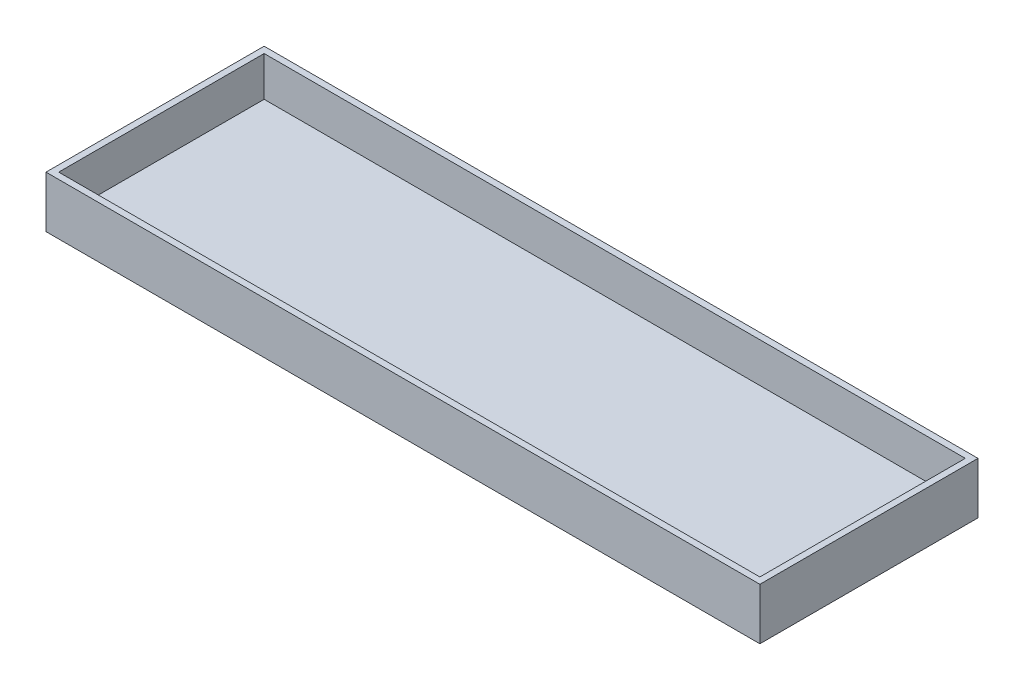
ISO-10303-21;
HEADER;
FILE_DESCRIPTION(('STEP AP214'),'2;1');
FILE_NAME('part.step','',(''),(''),'','','');
FILE_SCHEMA(('AUTOMOTIVE_DESIGN { 1 0 10303 214 1 1 1 1 }'));
ENDSEC;
DATA;
#1=APPLICATION_CONTEXT('core data for automotive mechanical design processes');
#2=APPLICATION_PROTOCOL_DEFINITION('international standard','automotive_design',2000,#1);
#3=PRODUCT_CONTEXT('',#1,'mechanical');
#4=PRODUCT('Part','Part','',(#3));
#5=PRODUCT_RELATED_PRODUCT_CATEGORY('part','',(#4));
#6=PRODUCT_DEFINITION_FORMATION('','',#4);
#7=PRODUCT_DEFINITION_CONTEXT('part definition',#1,'design');
#8=PRODUCT_DEFINITION('design','',#6,#7);
#9=PRODUCT_DEFINITION_SHAPE('','',#8);
#10=(LENGTH_UNIT() NAMED_UNIT(*) SI_UNIT(.MILLI.,.METRE.));
#11=(NAMED_UNIT(*) PLANE_ANGLE_UNIT() SI_UNIT($,.RADIAN.));
#12=(NAMED_UNIT(*) SI_UNIT($,.STERADIAN.) SOLID_ANGLE_UNIT());
#13=UNCERTAINTY_MEASURE_WITH_UNIT(LENGTH_MEASURE(1.E-05),#10,'distance_accuracy_value','');
#14=(GEOMETRIC_REPRESENTATION_CONTEXT(3) GLOBAL_UNCERTAINTY_ASSIGNED_CONTEXT((#13)) GLOBAL_UNIT_ASSIGNED_CONTEXT((#10,
#11,#12)) REPRESENTATION_CONTEXT('',''));
#15=CARTESIAN_POINT('',(0.,0.,0.));
#16=DIRECTION('',(0.,0.,1.));
#17=DIRECTION('',(1.,0.,0.));
#18=AXIS2_PLACEMENT_3D('',#15,#16,#17);
#19=CARTESIAN_POINT('',(90.,3.,-27.5));
#20=DIRECTION('',(-1.,0.,0.));
#21=DIRECTION('',(0.,0.,1.));
#22=AXIS2_PLACEMENT_3D('',#19,#20,#21);
#23=PLANE('',#22);
#24=DIRECTION('',(0.,0.,-1.));
#25=VECTOR('',#24,1.);
#26=CARTESIAN_POINT('',(90.,0.,-27.5));
#27=LINE('',#26,#25);
#28=CARTESIAN_POINT('',(90.,0.,27.5));
#29=VERTEX_POINT('',#28);
#30=CARTESIAN_POINT('',(90.,0.,-27.5));
#31=VERTEX_POINT('',#30);
#32=EDGE_CURVE('E144',#29,#31,#27,.T.);
#33=ORIENTED_EDGE('',*,*,#32,.T.);
#34=DIRECTION('',(0.,-1.,0.));
#35=VECTOR('',#34,1.);
#36=CARTESIAN_POINT('',(90.,3.,-27.5));
#37=LINE('',#36,#35);
#38=CARTESIAN_POINT('',(90.,13.,-27.5));
#39=VERTEX_POINT('',#38);
#40=EDGE_CURVE('E11',#39,#31,#37,.T.);
#41=ORIENTED_EDGE('',*,*,#40,.F.);
#42=DIRECTION('',(0.,0.,-1.));
#43=VECTOR('',#42,1.);
#44=CARTESIAN_POINT('',(90.,13.,27.5));
#45=LINE('',#44,#43);
#46=CARTESIAN_POINT('',(90.,13.,27.5));
#47=VERTEX_POINT('',#46);
#48=EDGE_CURVE('E135',#47,#39,#45,.T.);
#49=ORIENTED_EDGE('',*,*,#48,.F.);
#50=DIRECTION('',(0.,-1.,0.));
#51=VECTOR('',#50,1.);
#52=CARTESIAN_POINT('',(90.,3.,27.5));
#53=LINE('',#52,#51);
#54=EDGE_CURVE('E153',#47,#29,#53,.T.);
#55=ORIENTED_EDGE('',*,*,#54,.T.);
#56=EDGE_LOOP('',(#33,#41,#49,#55));
#57=FACE_BOUND('',#56,.T.);
#58=ADVANCED_FACE('F33',(#57),#23,.F.);
#59=CARTESIAN_POINT('',(-90.,3.,-27.5));
#60=DIRECTION('',(0.,0.,1.));
#61=DIRECTION('',(1.,0.,0.));
#62=AXIS2_PLACEMENT_3D('',#59,#60,#61);
#63=PLANE('',#62);
#64=DIRECTION('',(-1.,0.,0.));
#65=VECTOR('',#64,1.);
#66=CARTESIAN_POINT('',(-90.,0.,-27.5));
#67=LINE('',#66,#65);
#68=CARTESIAN_POINT('',(-90.,0.,-27.5));
#69=VERTEX_POINT('',#68);
#70=EDGE_CURVE('E147',#31,#69,#67,.T.);
#71=ORIENTED_EDGE('',*,*,#70,.T.);
#72=DIRECTION('',(0.,-1.,0.));
#73=VECTOR('',#72,1.);
#74=CARTESIAN_POINT('',(-90.,3.,-27.5));
#75=LINE('',#74,#73);
#76=CARTESIAN_POINT('',(-90.,13.,-27.5));
#77=VERTEX_POINT('',#76);
#78=EDGE_CURVE('E40',#77,#69,#75,.T.);
#79=ORIENTED_EDGE('',*,*,#78,.F.);
#80=DIRECTION('',(-1.,0.,0.));
#81=VECTOR('',#80,1.);
#82=CARTESIAN_POINT('',(90.,13.,-27.5));
#83=LINE('',#82,#81);
#84=EDGE_CURVE('E138',#39,#77,#83,.T.);
#85=ORIENTED_EDGE('',*,*,#84,.F.);
#86=ORIENTED_EDGE('',*,*,#40,.T.);
#87=EDGE_LOOP('',(#71,#79,#85,#86));
#88=FACE_BOUND('',#87,.T.);
#89=ADVANCED_FACE('F175',(#88),#63,.F.);
#90=CARTESIAN_POINT('',(-90.,3.,-27.5));
#91=DIRECTION('',(1.,0.,0.));
#92=DIRECTION('',(0.,0.,-1.));
#93=AXIS2_PLACEMENT_3D('',#90,#91,#92);
#94=PLANE('',#93);
#95=DIRECTION('',(0.,0.,1.));
#96=VECTOR('',#95,1.);
#97=CARTESIAN_POINT('',(-90.,0.,-27.5));
#98=LINE('',#97,#96);
#99=CARTESIAN_POINT('',(-90.,0.,27.5));
#100=VERTEX_POINT('',#99);
#101=EDGE_CURVE('E149',#69,#100,#98,.T.);
#102=ORIENTED_EDGE('',*,*,#101,.T.);
#103=DIRECTION('',(0.,-1.,0.));
#104=VECTOR('',#103,1.);
#105=CARTESIAN_POINT('',(-90.,3.,27.5));
#106=LINE('',#105,#104);
#107=CARTESIAN_POINT('',(-90.,13.,27.5));
#108=VERTEX_POINT('',#107);
#109=EDGE_CURVE('E156',#108,#100,#106,.T.);
#110=ORIENTED_EDGE('',*,*,#109,.F.);
#111=DIRECTION('',(0.,0.,1.));
#112=VECTOR('',#111,1.);
#113=CARTESIAN_POINT('',(-90.,13.,-27.5));
#114=LINE('',#113,#112);
#115=EDGE_CURVE('E141',#77,#108,#114,.T.);
#116=ORIENTED_EDGE('',*,*,#115,.F.);
#117=ORIENTED_EDGE('',*,*,#78,.T.);
#118=EDGE_LOOP('',(#102,#110,#116,#117));
#119=FACE_BOUND('',#118,.T.);
#120=ADVANCED_FACE('F162',(#119),#94,.F.);
#121=CARTESIAN_POINT('',(-90.,3.,27.5));
#122=DIRECTION('',(0.,0.,-1.));
#123=DIRECTION('',(-1.,0.,0.));
#124=AXIS2_PLACEMENT_3D('',#121,#122,#123);
#125=PLANE('',#124);
#126=DIRECTION('',(1.,0.,0.));
#127=VECTOR('',#126,1.);
#128=CARTESIAN_POINT('',(-90.,0.,27.5));
#129=LINE('',#128,#127);
#130=EDGE_CURVE('E151',#100,#29,#129,.T.);
#131=ORIENTED_EDGE('',*,*,#130,.T.);
#132=ORIENTED_EDGE('',*,*,#54,.F.);
#133=DIRECTION('',(1.,0.,0.));
#134=VECTOR('',#133,1.);
#135=CARTESIAN_POINT('',(-90.,13.,27.5));
#136=LINE('',#135,#134);
#137=EDGE_CURVE('E111',#108,#47,#136,.T.);
#138=ORIENTED_EDGE('',*,*,#137,.F.);
#139=ORIENTED_EDGE('',*,*,#109,.T.);
#140=EDGE_LOOP('',(#131,#132,#138,#139));
#141=FACE_BOUND('',#140,.T.);
#142=ADVANCED_FACE('F170',(#141),#125,.F.);
#143=CARTESIAN_POINT('',(0.,0.,0.));
#144=DIRECTION('',(0.,1.,0.));
#145=DIRECTION('',(0.,0.,1.));
#146=AXIS2_PLACEMENT_3D('',#143,#144,#145);
#147=PLANE('',#146);
#148=ORIENTED_EDGE('',*,*,#32,.F.);
#149=ORIENTED_EDGE('',*,*,#130,.F.);
#150=ORIENTED_EDGE('',*,*,#101,.F.);
#151=ORIENTED_EDGE('',*,*,#70,.F.);
#152=EDGE_LOOP('',(#148,#149,#150,#151));
#153=FACE_BOUND('',#152,.T.);
#154=ADVANCED_FACE('F168',(#153),#147,.F.);
#155=CARTESIAN_POINT('',(0.,13.,0.));
#156=DIRECTION('',(0.,1.,0.));
#157=DIRECTION('',(0.,0.,1.));
#158=AXIS2_PLACEMENT_3D('',#155,#156,#157);
#159=PLANE('',#158);
#160=ORIENTED_EDGE('',*,*,#137,.T.);
#161=ORIENTED_EDGE('',*,*,#48,.T.);
#162=ORIENTED_EDGE('',*,*,#84,.T.);
#163=ORIENTED_EDGE('',*,*,#115,.T.);
#164=EDGE_LOOP('',(#160,#161,#162,#163));
#165=FACE_BOUND('',#164,.T.);
#166=DIRECTION('',(-1.,0.,0.));
#167=VECTOR('',#166,1.);
#168=CARTESIAN_POINT('',(-88.4,13.,-25.9));
#169=LINE('',#168,#167);
#170=CARTESIAN_POINT('',(88.4,13.,-25.9));
#171=VERTEX_POINT('',#170);
#172=CARTESIAN_POINT('',(-88.4,13.,-25.9));
#173=VERTEX_POINT('',#172);
#174=EDGE_CURVE('E105',#171,#173,#169,.T.);
#175=ORIENTED_EDGE('',*,*,#174,.F.);
#176=DIRECTION('',(0.,0.,-1.));
#177=VECTOR('',#176,1.);
#178=CARTESIAN_POINT('',(88.4,13.,-25.9));
#179=LINE('',#178,#177);
#180=CARTESIAN_POINT('',(88.4,13.,25.9));
#181=VERTEX_POINT('',#180);
#182=EDGE_CURVE('E96',#181,#171,#179,.T.);
#183=ORIENTED_EDGE('',*,*,#182,.F.);
#184=DIRECTION('',(1.,0.,0.));
#185=VECTOR('',#184,1.);
#186=CARTESIAN_POINT('',(-88.4,13.,25.9));
#187=LINE('',#186,#185);
#188=CARTESIAN_POINT('',(-88.4,13.,25.9));
#189=VERTEX_POINT('',#188);
#190=EDGE_CURVE('E119',#189,#181,#187,.T.);
#191=ORIENTED_EDGE('',*,*,#190,.F.);
#192=DIRECTION('',(0.,0.,1.));
#193=VECTOR('',#192,1.);
#194=CARTESIAN_POINT('',(-88.4,13.,-25.9));
#195=LINE('',#194,#193);
#196=EDGE_CURVE('E117',#173,#189,#195,.T.);
#197=ORIENTED_EDGE('',*,*,#196,.F.);
#198=EDGE_LOOP('',(#175,#183,#191,#197));
#199=FACE_BOUND('',#198,.T.);
#200=ADVANCED_FACE('F115',(#165,#199),#159,.T.);
#201=CARTESIAN_POINT('',(88.4,13.,-25.9));
#202=DIRECTION('',(-1.,0.,0.));
#203=DIRECTION('',(0.,0.,1.));
#204=AXIS2_PLACEMENT_3D('',#201,#202,#203);
#205=PLANE('',#204);
#206=DIRECTION('',(0.,0.,-1.));
#207=VECTOR('',#206,1.);
#208=CARTESIAN_POINT('',(88.4,3.,-25.9));
#209=LINE('',#208,#207);
#210=CARTESIAN_POINT('',(88.4,3.,25.9));
#211=VERTEX_POINT('',#210);
#212=CARTESIAN_POINT('',(88.4,3.,-25.9));
#213=VERTEX_POINT('',#212);
#214=EDGE_CURVE('E47',#211,#213,#209,.T.);
#215=ORIENTED_EDGE('',*,*,#214,.F.);
#216=DIRECTION('',(0.,-1.,0.));
#217=VECTOR('',#216,1.);
#218=CARTESIAN_POINT('',(88.4,13.,25.9));
#219=LINE('',#218,#217);
#220=EDGE_CURVE('E101',#181,#211,#219,.T.);
#221=ORIENTED_EDGE('',*,*,#220,.F.);
#222=ORIENTED_EDGE('',*,*,#182,.T.);
#223=DIRECTION('',(0.,-1.,0.));
#224=VECTOR('',#223,1.);
#225=CARTESIAN_POINT('',(88.4,13.,-25.9));
#226=LINE('',#225,#224);
#227=EDGE_CURVE('E99',#171,#213,#226,.T.);
#228=ORIENTED_EDGE('',*,*,#227,.T.);
#229=EDGE_LOOP('',(#215,#221,#222,#228));
#230=FACE_BOUND('',#229,.T.);
#231=ADVANCED_FACE('F98',(#230),#205,.T.);
#232=CARTESIAN_POINT('',(-88.4,13.,-25.9));
#233=DIRECTION('',(0.,0.,1.));
#234=DIRECTION('',(1.,0.,0.));
#235=AXIS2_PLACEMENT_3D('',#232,#233,#234);
#236=PLANE('',#235);
#237=DIRECTION('',(-1.,0.,0.));
#238=VECTOR('',#237,1.);
#239=CARTESIAN_POINT('',(-88.4,3.,-25.9));
#240=LINE('',#239,#238);
#241=CARTESIAN_POINT('',(-88.4,3.,-25.9));
#242=VERTEX_POINT('',#241);
#243=EDGE_CURVE('E51',#213,#242,#240,.T.);
#244=ORIENTED_EDGE('',*,*,#243,.F.);
#245=ORIENTED_EDGE('',*,*,#227,.F.);
#246=ORIENTED_EDGE('',*,*,#174,.T.);
#247=DIRECTION('',(0.,-1.,0.));
#248=VECTOR('',#247,1.);
#249=CARTESIAN_POINT('',(-88.4,13.,-25.9));
#250=LINE('',#249,#248);
#251=EDGE_CURVE('E112',#173,#242,#250,.T.);
#252=ORIENTED_EDGE('',*,*,#251,.T.);
#253=EDGE_LOOP('',(#244,#245,#246,#252));
#254=FACE_BOUND('',#253,.T.);
#255=ADVANCED_FACE('F109',(#254),#236,.T.);
#256=CARTESIAN_POINT('',(-88.4,13.,-25.9));
#257=DIRECTION('',(1.,0.,0.));
#258=DIRECTION('',(0.,0.,-1.));
#259=AXIS2_PLACEMENT_3D('',#256,#257,#258);
#260=PLANE('',#259);
#261=DIRECTION('',(0.,0.,1.));
#262=VECTOR('',#261,1.);
#263=CARTESIAN_POINT('',(-88.4,3.,-25.9));
#264=LINE('',#263,#262);
#265=CARTESIAN_POINT('',(-88.4,3.,25.9));
#266=VERTEX_POINT('',#265);
#267=EDGE_CURVE('E125',#242,#266,#264,.T.);
#268=ORIENTED_EDGE('',*,*,#267,.F.);
#269=ORIENTED_EDGE('',*,*,#251,.F.);
#270=ORIENTED_EDGE('',*,*,#196,.T.);
#271=DIRECTION('',(0.,-1.,0.));
#272=VECTOR('',#271,1.);
#273=CARTESIAN_POINT('',(-88.4,13.,25.9));
#274=LINE('',#273,#272);
#275=EDGE_CURVE('E129',#189,#266,#274,.T.);
#276=ORIENTED_EDGE('',*,*,#275,.T.);
#277=EDGE_LOOP('',(#268,#269,#270,#276));
#278=FACE_BOUND('',#277,.T.);
#279=ADVANCED_FACE('F197',(#278),#260,.T.);
#280=CARTESIAN_POINT('',(-88.4,13.,25.9));
#281=DIRECTION('',(0.,0.,-1.));
#282=DIRECTION('',(-1.,0.,0.));
#283=AXIS2_PLACEMENT_3D('',#280,#281,#282);
#284=PLANE('',#283);
#285=DIRECTION('',(1.,0.,0.));
#286=VECTOR('',#285,1.);
#287=CARTESIAN_POINT('',(-88.4,3.,25.9));
#288=LINE('',#287,#286);
#289=EDGE_CURVE('E106',#266,#211,#288,.T.);
#290=ORIENTED_EDGE('',*,*,#289,.F.);
#291=ORIENTED_EDGE('',*,*,#275,.F.);
#292=ORIENTED_EDGE('',*,*,#190,.T.);
#293=ORIENTED_EDGE('',*,*,#220,.T.);
#294=EDGE_LOOP('',(#290,#291,#292,#293));
#295=FACE_BOUND('',#294,.T.);
#296=ADVANCED_FACE('F190',(#295),#284,.T.);
#297=CARTESIAN_POINT('',(0.,3.,0.));
#298=DIRECTION('',(0.,1.,0.));
#299=DIRECTION('',(0.,0.,1.));
#300=AXIS2_PLACEMENT_3D('',#297,#298,#299);
#301=PLANE('',#300);
#302=ORIENTED_EDGE('',*,*,#214,.T.);
#303=ORIENTED_EDGE('',*,*,#243,.T.);
#304=ORIENTED_EDGE('',*,*,#267,.T.);
#305=ORIENTED_EDGE('',*,*,#289,.T.);
#306=EDGE_LOOP('',(#302,#303,#304,#305));
#307=FACE_BOUND('',#306,.T.);
#308=ADVANCED_FACE('F187',(#307),#301,.T.);
#309=CLOSED_SHELL('',(#58,#89,#120,#142,#154,#200,#231,#255,#279,#296,#308));
#310=MANIFOLD_SOLID_BREP('B2',#309);
#311=ADVANCED_BREP_SHAPE_REPRESENTATION('',(#18,#310),#14);
#312=SHAPE_DEFINITION_REPRESENTATION(#9,#311);
ENDSEC;
END-ISO-10303-21;
